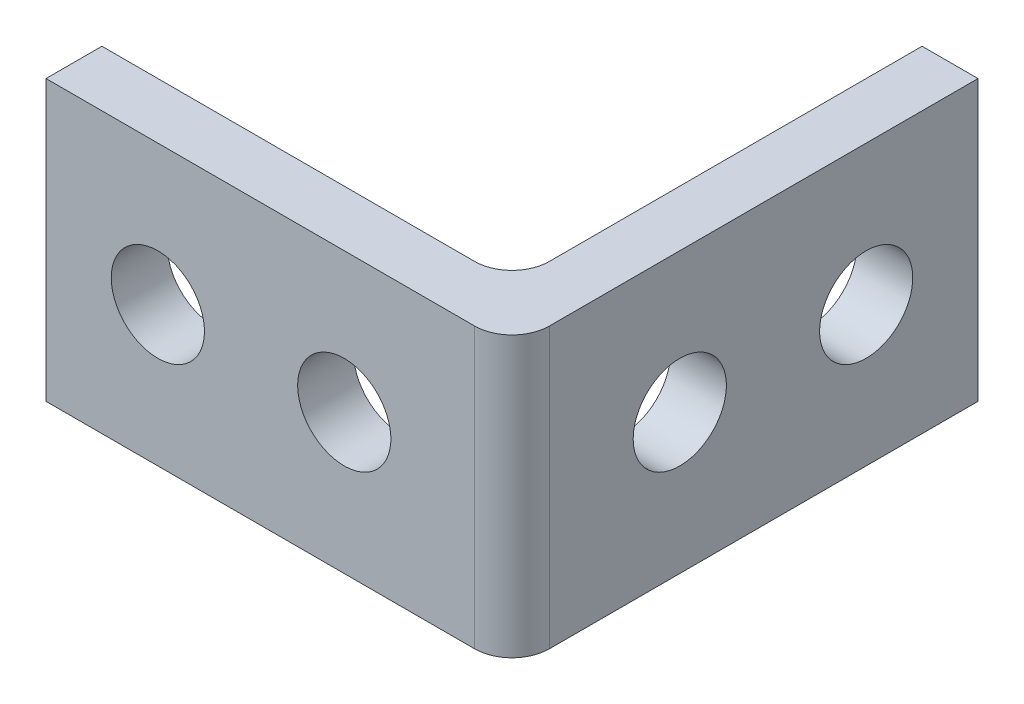
ISO-10303-21;
HEADER;
FILE_DESCRIPTION(('STEP AP214'),'2;1');
FILE_NAME('part.step','',(''),(''),'','','');
FILE_SCHEMA(('AUTOMOTIVE_DESIGN { 1 0 10303 214 1 1 1 1 }'));
ENDSEC;
DATA;
#1=APPLICATION_CONTEXT('core data for automotive mechanical design processes');
#2=APPLICATION_PROTOCOL_DEFINITION('international standard','automotive_design',2000,#1);
#3=PRODUCT_CONTEXT('',#1,'mechanical');
#4=PRODUCT('Part','Part','',(#3));
#5=PRODUCT_RELATED_PRODUCT_CATEGORY('part','',(#4));
#6=PRODUCT_DEFINITION_FORMATION('','',#4);
#7=PRODUCT_DEFINITION_CONTEXT('part definition',#1,'design');
#8=PRODUCT_DEFINITION('design','',#6,#7);
#9=PRODUCT_DEFINITION_SHAPE('','',#8);
#10=(LENGTH_UNIT() NAMED_UNIT(*) SI_UNIT(.MILLI.,.METRE.));
#11=(NAMED_UNIT(*) PLANE_ANGLE_UNIT() SI_UNIT($,.RADIAN.));
#12=(NAMED_UNIT(*) SI_UNIT($,.STERADIAN.) SOLID_ANGLE_UNIT());
#13=UNCERTAINTY_MEASURE_WITH_UNIT(LENGTH_MEASURE(1.E-05),#10,'distance_accuracy_value','');
#14=(GEOMETRIC_REPRESENTATION_CONTEXT(3) GLOBAL_UNCERTAINTY_ASSIGNED_CONTEXT((#13)) GLOBAL_UNIT_ASSIGNED_CONTEXT((#10,
#11,#12)) REPRESENTATION_CONTEXT('',''));
#15=CARTESIAN_POINT('',(0.,0.,0.));
#16=DIRECTION('',(0.,0.,1.));
#17=DIRECTION('',(1.,0.,0.));
#18=AXIS2_PLACEMENT_3D('',#15,#16,#17);
#19=CARTESIAN_POINT('',(0.,15.,-3.));
#20=DIRECTION('',(1.,0.,0.));
#21=DIRECTION('',(0.,0.,-1.));
#22=AXIS2_PLACEMENT_3D('',#19,#20,#21);
#23=PLANE('',#22);
#24=DIRECTION('',(0.,0.,1.));
#25=VECTOR('',#24,1.);
#26=CARTESIAN_POINT('',(0.,0.,-3.));
#27=LINE('',#26,#25);
#28=CARTESIAN_POINT('',(0.,0.,-3.));
#29=VERTEX_POINT('',#28);
#30=CARTESIAN_POINT('',(0.,0.,0.));
#31=VERTEX_POINT('',#30);
#32=EDGE_CURVE('E134',#29,#31,#27,.T.);
#33=ORIENTED_EDGE('',*,*,#32,.T.);
#34=DIRECTION('',(0.,-1.,0.));
#35=VECTOR('',#34,1.);
#36=CARTESIAN_POINT('',(0.,15.,0.));
#37=LINE('',#36,#35);
#38=CARTESIAN_POINT('',(0.,15.,0.));
#39=VERTEX_POINT('',#38);
#40=EDGE_CURVE('E11',#39,#31,#37,.T.);
#41=ORIENTED_EDGE('',*,*,#40,.F.);
#42=DIRECTION('',(0.,0.,1.));
#43=VECTOR('',#42,1.);
#44=CARTESIAN_POINT('',(0.,15.,-3.));
#45=LINE('',#44,#43);
#46=CARTESIAN_POINT('',(0.,15.,-3.));
#47=VERTEX_POINT('',#46);
#48=EDGE_CURVE('E149',#47,#39,#45,.T.);
#49=ORIENTED_EDGE('',*,*,#48,.F.);
#50=DIRECTION('',(0.,-1.,0.));
#51=VECTOR('',#50,1.);
#52=CARTESIAN_POINT('',(0.,15.,-3.));
#53=LINE('',#52,#51);
#54=EDGE_CURVE('E130',#47,#29,#53,.T.);
#55=ORIENTED_EDGE('',*,*,#54,.T.);
#56=EDGE_LOOP('',(#33,#41,#49,#55));
#57=FACE_BOUND('',#56,.T.);
#58=ADVANCED_FACE('F38',(#57),#23,.F.);
#59=CARTESIAN_POINT('',(0.,15.,0.));
#60=DIRECTION('',(0.,0.,-1.));
#61=DIRECTION('',(-1.,0.,0.));
#62=AXIS2_PLACEMENT_3D('',#59,#60,#61);
#63=PLANE('',#62);
#64=CARTESIAN_POINT('',(16.,7.5,0.));
#65=DIRECTION('',(0.,0.,-1.));
#66=DIRECTION('',(-1.,0.,0.));
#67=AXIS2_PLACEMENT_3D('',#64,#65,#66);
#68=CIRCLE('',#67,2.5);
#69=CARTESIAN_POINT('',(13.5,7.5,0.));
#70=VERTEX_POINT('',#69);
#71=EDGE_CURVE('E138',#70,#70,#68,.T.);
#72=ORIENTED_EDGE('',*,*,#71,.T.);
#73=EDGE_LOOP('',(#72));
#74=FACE_BOUND('',#73,.T.);
#75=CARTESIAN_POINT('',(6.,7.5,0.));
#76=DIRECTION('',(0.,0.,-1.));
#77=DIRECTION('',(-1.,0.,0.));
#78=AXIS2_PLACEMENT_3D('',#75,#76,#77);
#79=CIRCLE('',#78,2.5);
#80=CARTESIAN_POINT('',(3.5,7.5,0.));
#81=VERTEX_POINT('',#80);
#82=EDGE_CURVE('E184',#81,#81,#79,.T.);
#83=ORIENTED_EDGE('',*,*,#82,.T.);
#84=EDGE_LOOP('',(#83));
#85=FACE_BOUND('',#84,.T.);
#86=DIRECTION('',(1.,0.,0.));
#87=VECTOR('',#86,1.);
#88=CARTESIAN_POINT('',(0.,0.,0.));
#89=LINE('',#88,#87);
#90=CARTESIAN_POINT('',(23.,0.,0.));
#91=VERTEX_POINT('',#90);
#92=EDGE_CURVE('E137',#31,#91,#89,.T.);
#93=ORIENTED_EDGE('',*,*,#92,.T.);
#94=DIRECTION('',(0.,-1.,0.));
#95=VECTOR('',#94,1.);
#96=CARTESIAN_POINT('',(23.,15.,0.));
#97=LINE('',#96,#95);
#98=CARTESIAN_POINT('',(23.,15.,0.));
#99=VERTEX_POINT('',#98);
#100=EDGE_CURVE('E46',#99,#91,#97,.T.);
#101=ORIENTED_EDGE('',*,*,#100,.F.);
#102=DIRECTION('',(1.,0.,0.));
#103=VECTOR('',#102,1.);
#104=CARTESIAN_POINT('',(0.,15.,0.));
#105=LINE('',#104,#103);
#106=EDGE_CURVE('E97',#39,#99,#105,.T.);
#107=ORIENTED_EDGE('',*,*,#106,.F.);
#108=ORIENTED_EDGE('',*,*,#40,.T.);
#109=EDGE_LOOP('',(#93,#101,#107,#108));
#110=FACE_BOUND('',#109,.T.);
#111=ADVANCED_FACE('F229',(#74,#85,#110),#63,.F.);
#112=CARTESIAN_POINT('',(23.,15.,-2.));
#113=DIRECTION('',(0.,-1.,0.));
#114=DIRECTION('',(0.,0.,-1.));
#115=AXIS2_PLACEMENT_3D('',#112,#113,#114);
#116=CYLINDRICAL_SURFACE('',#115,2.);
#117=CARTESIAN_POINT('',(23.,0.,-2.));
#118=DIRECTION('',(0.,1.,0.));
#119=DIRECTION('',(0.,0.,1.));
#120=AXIS2_PLACEMENT_3D('',#117,#118,#119);
#121=CIRCLE('',#120,2.);
#122=CARTESIAN_POINT('',(25.,0.,-2.));
#123=VERTEX_POINT('',#122);
#124=EDGE_CURVE('E140',#91,#123,#121,.T.);
#125=ORIENTED_EDGE('',*,*,#124,.T.);
#126=DIRECTION('',(0.,-1.,0.));
#127=VECTOR('',#126,1.);
#128=CARTESIAN_POINT('',(25.,15.,-2.));
#129=LINE('',#128,#127);
#130=CARTESIAN_POINT('',(25.,15.,-2.));
#131=VERTEX_POINT('',#130);
#132=EDGE_CURVE('E156',#131,#123,#129,.T.);
#133=ORIENTED_EDGE('',*,*,#132,.F.);
#134=CARTESIAN_POINT('',(23.,15.,-2.));
#135=DIRECTION('',(0.,1.,0.));
#136=DIRECTION('',(0.,0.,1.));
#137=AXIS2_PLACEMENT_3D('',#134,#135,#136);
#138=CIRCLE('',#137,2.);
#139=EDGE_CURVE('E164',#99,#131,#138,.T.);
#140=ORIENTED_EDGE('',*,*,#139,.F.);
#141=ORIENTED_EDGE('',*,*,#100,.T.);
#142=EDGE_LOOP('',(#125,#133,#140,#141));
#143=FACE_BOUND('',#142,.T.);
#144=ADVANCED_FACE('F162',(#143),#116,.T.);
#145=CARTESIAN_POINT('',(25.,15.,-2.));
#146=DIRECTION('',(-1.,0.,0.));
#147=DIRECTION('',(0.,0.,1.));
#148=AXIS2_PLACEMENT_3D('',#145,#146,#147);
#149=PLANE('',#148);
#150=CARTESIAN_POINT('',(25.,7.5,-9.));
#151=DIRECTION('',(-1.,0.,0.));
#152=DIRECTION('',(0.,0.,1.));
#153=AXIS2_PLACEMENT_3D('',#150,#151,#152);
#154=CIRCLE('',#153,2.5);
#155=CARTESIAN_POINT('',(25.,7.5,-6.5));
#156=VERTEX_POINT('',#155);
#157=EDGE_CURVE('E191',#156,#156,#154,.T.);
#158=ORIENTED_EDGE('',*,*,#157,.T.);
#159=EDGE_LOOP('',(#158));
#160=FACE_BOUND('',#159,.T.);
#161=CARTESIAN_POINT('',(25.,7.5,-19.));
#162=DIRECTION('',(-1.,0.,0.));
#163=DIRECTION('',(0.,0.,1.));
#164=AXIS2_PLACEMENT_3D('',#161,#162,#163);
#165=CIRCLE('',#164,2.5);
#166=CARTESIAN_POINT('',(25.,7.5,-16.5));
#167=VERTEX_POINT('',#166);
#168=EDGE_CURVE('E196',#167,#167,#165,.T.);
#169=ORIENTED_EDGE('',*,*,#168,.T.);
#170=EDGE_LOOP('',(#169));
#171=FACE_BOUND('',#170,.T.);
#172=DIRECTION('',(0.,0.,-1.));
#173=VECTOR('',#172,1.);
#174=CARTESIAN_POINT('',(25.,0.,-2.));
#175=LINE('',#174,#173);
#176=CARTESIAN_POINT('',(25.,0.,-25.));
#177=VERTEX_POINT('',#176);
#178=EDGE_CURVE('E142',#123,#177,#175,.T.);
#179=ORIENTED_EDGE('',*,*,#178,.T.);
#180=DIRECTION('',(0.,-1.,0.));
#181=VECTOR('',#180,1.);
#182=CARTESIAN_POINT('',(25.,15.,-25.));
#183=LINE('',#182,#181);
#184=CARTESIAN_POINT('',(25.,15.,-25.));
#185=VERTEX_POINT('',#184);
#186=EDGE_CURVE('E153',#185,#177,#183,.T.);
#187=ORIENTED_EDGE('',*,*,#186,.F.);
#188=DIRECTION('',(0.,0.,-1.));
#189=VECTOR('',#188,1.);
#190=CARTESIAN_POINT('',(25.,15.,-2.));
#191=LINE('',#190,#189);
#192=EDGE_CURVE('E176',#131,#185,#191,.T.);
#193=ORIENTED_EDGE('',*,*,#192,.F.);
#194=ORIENTED_EDGE('',*,*,#132,.T.);
#195=EDGE_LOOP('',(#179,#187,#193,#194));
#196=FACE_BOUND('',#195,.T.);
#197=ADVANCED_FACE('F172',(#160,#171,#196),#149,.F.);
#198=CARTESIAN_POINT('',(25.,15.,-25.));
#199=DIRECTION('',(0.,0.,1.));
#200=DIRECTION('',(1.,0.,0.));
#201=AXIS2_PLACEMENT_3D('',#198,#199,#200);
#202=PLANE('',#201);
#203=DIRECTION('',(-1.,0.,0.));
#204=VECTOR('',#203,1.);
#205=CARTESIAN_POINT('',(25.,0.,-25.));
#206=LINE('',#205,#204);
#207=CARTESIAN_POINT('',(22.,0.,-25.));
#208=VERTEX_POINT('',#207);
#209=EDGE_CURVE('E144',#177,#208,#206,.T.);
#210=ORIENTED_EDGE('',*,*,#209,.T.);
#211=DIRECTION('',(0.,-1.,0.));
#212=VECTOR('',#211,1.);
#213=CARTESIAN_POINT('',(22.,15.,-25.));
#214=LINE('',#213,#212);
#215=CARTESIAN_POINT('',(22.,15.,-25.));
#216=VERTEX_POINT('',#215);
#217=EDGE_CURVE('E125',#216,#208,#214,.T.);
#218=ORIENTED_EDGE('',*,*,#217,.F.);
#219=DIRECTION('',(-1.,0.,0.));
#220=VECTOR('',#219,1.);
#221=CARTESIAN_POINT('',(25.,15.,-25.));
#222=LINE('',#221,#220);
#223=EDGE_CURVE('E116',#185,#216,#222,.T.);
#224=ORIENTED_EDGE('',*,*,#223,.F.);
#225=ORIENTED_EDGE('',*,*,#186,.T.);
#226=EDGE_LOOP('',(#210,#218,#224,#225));
#227=FACE_BOUND('',#226,.T.);
#228=ADVANCED_FACE('F175',(#227),#202,.F.);
#229=CARTESIAN_POINT('',(22.,15.,-25.));
#230=DIRECTION('',(1.,0.,0.));
#231=DIRECTION('',(0.,0.,-1.));
#232=AXIS2_PLACEMENT_3D('',#229,#230,#231);
#233=PLANE('',#232);
#234=CARTESIAN_POINT('',(22.,7.5,-9.));
#235=DIRECTION('',(-1.,0.,0.));
#236=DIRECTION('',(0.,0.,1.));
#237=AXIS2_PLACEMENT_3D('',#234,#235,#236);
#238=CIRCLE('',#237,2.5);
#239=CARTESIAN_POINT('',(22.,7.5,-6.5));
#240=VERTEX_POINT('',#239);
#241=EDGE_CURVE('E199',#240,#240,#238,.T.);
#242=ORIENTED_EDGE('',*,*,#241,.F.);
#243=EDGE_LOOP('',(#242));
#244=FACE_BOUND('',#243,.T.);
#245=CARTESIAN_POINT('',(22.,7.5,-19.));
#246=DIRECTION('',(-1.,0.,0.));
#247=DIRECTION('',(0.,0.,1.));
#248=AXIS2_PLACEMENT_3D('',#245,#246,#247);
#249=CIRCLE('',#248,2.5);
#250=CARTESIAN_POINT('',(22.,7.5,-16.5));
#251=VERTEX_POINT('',#250);
#252=EDGE_CURVE('E200',#251,#251,#249,.T.);
#253=ORIENTED_EDGE('',*,*,#252,.F.);
#254=EDGE_LOOP('',(#253));
#255=FACE_BOUND('',#254,.T.);
#256=DIRECTION('',(0.,0.,1.));
#257=VECTOR('',#256,1.);
#258=CARTESIAN_POINT('',(22.,0.,-25.));
#259=LINE('',#258,#257);
#260=CARTESIAN_POINT('',(22.,0.,-5.));
#261=VERTEX_POINT('',#260);
#262=EDGE_CURVE('E124',#208,#261,#259,.T.);
#263=ORIENTED_EDGE('',*,*,#262,.T.);
#264=DIRECTION('',(0.,-1.,0.));
#265=VECTOR('',#264,1.);
#266=CARTESIAN_POINT('',(22.,15.,-5.));
#267=LINE('',#266,#265);
#268=CARTESIAN_POINT('',(22.,15.,-5.));
#269=VERTEX_POINT('',#268);
#270=EDGE_CURVE('E121',#269,#261,#267,.T.);
#271=ORIENTED_EDGE('',*,*,#270,.F.);
#272=DIRECTION('',(0.,0.,1.));
#273=VECTOR('',#272,1.);
#274=CARTESIAN_POINT('',(22.,15.,-25.));
#275=LINE('',#274,#273);
#276=EDGE_CURVE('E110',#216,#269,#275,.T.);
#277=ORIENTED_EDGE('',*,*,#276,.F.);
#278=ORIENTED_EDGE('',*,*,#217,.T.);
#279=EDGE_LOOP('',(#263,#271,#277,#278));
#280=FACE_BOUND('',#279,.T.);
#281=ADVANCED_FACE('F122',(#244,#255,#280),#233,.F.);
#282=CARTESIAN_POINT('',(20.,15.,-5.));
#283=DIRECTION('',(0.,-1.,0.));
#284=DIRECTION('',(0.,0.,-1.));
#285=AXIS2_PLACEMENT_3D('',#282,#283,#284);
#286=CYLINDRICAL_SURFACE('',#285,2.);
#287=CARTESIAN_POINT('',(20.,0.,-5.));
#288=DIRECTION('',(0.,-1.,0.));
#289=DIRECTION('',(0.,0.,-1.));
#290=AXIS2_PLACEMENT_3D('',#287,#288,#289);
#291=CIRCLE('',#290,2.);
#292=CARTESIAN_POINT('',(20.,0.,-3.));
#293=VERTEX_POINT('',#292);
#294=EDGE_CURVE('E83',#261,#293,#291,.T.);
#295=ORIENTED_EDGE('',*,*,#294,.T.);
#296=DIRECTION('',(0.,-1.,0.));
#297=VECTOR('',#296,1.);
#298=CARTESIAN_POINT('',(20.,15.,-3.));
#299=LINE('',#298,#297);
#300=CARTESIAN_POINT('',(20.,15.,-3.));
#301=VERTEX_POINT('',#300);
#302=EDGE_CURVE('E126',#301,#293,#299,.T.);
#303=ORIENTED_EDGE('',*,*,#302,.F.);
#304=CARTESIAN_POINT('',(20.,15.,-5.));
#305=DIRECTION('',(0.,-1.,0.));
#306=DIRECTION('',(0.,0.,-1.));
#307=AXIS2_PLACEMENT_3D('',#304,#305,#306);
#308=CIRCLE('',#307,2.);
#309=EDGE_CURVE('E114',#269,#301,#308,.T.);
#310=ORIENTED_EDGE('',*,*,#309,.F.);
#311=ORIENTED_EDGE('',*,*,#270,.T.);
#312=EDGE_LOOP('',(#295,#303,#310,#311));
#313=FACE_BOUND('',#312,.T.);
#314=ADVANCED_FACE('F128',(#313),#286,.F.);
#315=CARTESIAN_POINT('',(20.,15.,-3.));
#316=DIRECTION('',(0.,0.,1.));
#317=DIRECTION('',(1.,0.,0.));
#318=AXIS2_PLACEMENT_3D('',#315,#316,#317);
#319=PLANE('',#318);
#320=CARTESIAN_POINT('',(16.,7.5,-3.));
#321=DIRECTION('',(0.,0.,-1.));
#322=DIRECTION('',(-1.,0.,0.));
#323=AXIS2_PLACEMENT_3D('',#320,#321,#322);
#324=CIRCLE('',#323,2.5);
#325=CARTESIAN_POINT('',(13.5,7.5,-3.));
#326=VERTEX_POINT('',#325);
#327=EDGE_CURVE('E187',#326,#326,#324,.T.);
#328=ORIENTED_EDGE('',*,*,#327,.F.);
#329=EDGE_LOOP('',(#328));
#330=FACE_BOUND('',#329,.T.);
#331=CARTESIAN_POINT('',(6.,7.5,-3.));
#332=DIRECTION('',(0.,0.,-1.));
#333=DIRECTION('',(-1.,0.,0.));
#334=AXIS2_PLACEMENT_3D('',#331,#332,#333);
#335=CIRCLE('',#334,2.5);
#336=CARTESIAN_POINT('',(3.5,7.5,-3.));
#337=VERTEX_POINT('',#336);
#338=EDGE_CURVE('E188',#337,#337,#335,.T.);
#339=ORIENTED_EDGE('',*,*,#338,.F.);
#340=EDGE_LOOP('',(#339));
#341=FACE_BOUND('',#340,.T.);
#342=DIRECTION('',(-1.,0.,0.));
#343=VECTOR('',#342,1.);
#344=CARTESIAN_POINT('',(20.,0.,-3.));
#345=LINE('',#344,#343);
#346=EDGE_CURVE('E89',#293,#29,#345,.T.);
#347=ORIENTED_EDGE('',*,*,#346,.T.);
#348=ORIENTED_EDGE('',*,*,#54,.F.);
#349=DIRECTION('',(-1.,0.,0.));
#350=VECTOR('',#349,1.);
#351=CARTESIAN_POINT('',(20.,15.,-3.));
#352=LINE('',#351,#350);
#353=EDGE_CURVE('E54',#301,#47,#352,.T.);
#354=ORIENTED_EDGE('',*,*,#353,.F.);
#355=ORIENTED_EDGE('',*,*,#302,.T.);
#356=EDGE_LOOP('',(#347,#348,#354,#355));
#357=FACE_BOUND('',#356,.T.);
#358=ADVANCED_FACE('F239',(#330,#341,#357),#319,.F.);
#359=CARTESIAN_POINT('',(23.,15.,-2.));
#360=DIRECTION('',(0.,1.,0.));
#361=DIRECTION('',(0.,0.,1.));
#362=AXIS2_PLACEMENT_3D('',#359,#360,#361);
#363=PLANE('',#362);
#364=ORIENTED_EDGE('',*,*,#48,.T.);
#365=ORIENTED_EDGE('',*,*,#106,.T.);
#366=ORIENTED_EDGE('',*,*,#139,.T.);
#367=ORIENTED_EDGE('',*,*,#192,.T.);
#368=ORIENTED_EDGE('',*,*,#223,.T.);
#369=ORIENTED_EDGE('',*,*,#276,.T.);
#370=ORIENTED_EDGE('',*,*,#309,.T.);
#371=ORIENTED_EDGE('',*,*,#353,.T.);
#372=EDGE_LOOP('',(#364,#365,#366,#367,#368,#369,#370,#371));
#373=FACE_BOUND('',#372,.T.);
#374=ADVANCED_FACE('F112',(#373),#363,.T.);
#375=CARTESIAN_POINT('',(23.,0.,-2.));
#376=DIRECTION('',(0.,1.,0.));
#377=DIRECTION('',(0.,0.,1.));
#378=AXIS2_PLACEMENT_3D('',#375,#376,#377);
#379=PLANE('',#378);
#380=ORIENTED_EDGE('',*,*,#32,.F.);
#381=ORIENTED_EDGE('',*,*,#346,.F.);
#382=ORIENTED_EDGE('',*,*,#294,.F.);
#383=ORIENTED_EDGE('',*,*,#262,.F.);
#384=ORIENTED_EDGE('',*,*,#209,.F.);
#385=ORIENTED_EDGE('',*,*,#178,.F.);
#386=ORIENTED_EDGE('',*,*,#124,.F.);
#387=ORIENTED_EDGE('',*,*,#92,.F.);
#388=EDGE_LOOP('',(#380,#381,#382,#383,#384,#385,#386,#387));
#389=FACE_BOUND('',#388,.T.);
#390=ADVANCED_FACE('F168',(#389),#379,.F.);
#391=CARTESIAN_POINT('',(6.,7.5,17.));
#392=DIRECTION('',(0.,0.,-1.));
#393=DIRECTION('',(-1.,0.,0.));
#394=AXIS2_PLACEMENT_3D('',#391,#392,#393);
#395=CYLINDRICAL_SURFACE('',#394,2.5);
#396=ORIENTED_EDGE('',*,*,#338,.T.);
#397=EDGE_LOOP('',(#396));
#398=FACE_BOUND('',#397,.T.);
#399=ORIENTED_EDGE('',*,*,#82,.F.);
#400=EDGE_LOOP('',(#399));
#401=FACE_BOUND('',#400,.T.);
#402=ADVANCED_FACE('F253',(#398,#401),#395,.F.);
#403=CARTESIAN_POINT('',(16.,7.5,17.));
#404=DIRECTION('',(0.,0.,-1.));
#405=DIRECTION('',(-1.,0.,0.));
#406=AXIS2_PLACEMENT_3D('',#403,#404,#405);
#407=CYLINDRICAL_SURFACE('',#406,2.5);
#408=ORIENTED_EDGE('',*,*,#327,.T.);
#409=EDGE_LOOP('',(#408));
#410=FACE_BOUND('',#409,.T.);
#411=ORIENTED_EDGE('',*,*,#71,.F.);
#412=EDGE_LOOP('',(#411));
#413=FACE_BOUND('',#412,.T.);
#414=ADVANCED_FACE('F217',(#410,#413),#407,.F.);
#415=CARTESIAN_POINT('',(37.,7.5,-19.));
#416=DIRECTION('',(-1.,0.,0.));
#417=DIRECTION('',(0.,0.,1.));
#418=AXIS2_PLACEMENT_3D('',#415,#416,#417);
#419=CYLINDRICAL_SURFACE('',#418,2.5);
#420=ORIENTED_EDGE('',*,*,#252,.T.);
#421=EDGE_LOOP('',(#420));
#422=FACE_BOUND('',#421,.T.);
#423=ORIENTED_EDGE('',*,*,#168,.F.);
#424=EDGE_LOOP('',(#423));
#425=FACE_BOUND('',#424,.T.);
#426=ADVANCED_FACE('F214',(#422,#425),#419,.F.);
#427=CARTESIAN_POINT('',(37.,7.5,-9.));
#428=DIRECTION('',(-1.,0.,0.));
#429=DIRECTION('',(0.,0.,1.));
#430=AXIS2_PLACEMENT_3D('',#427,#428,#429);
#431=CYLINDRICAL_SURFACE('',#430,2.5);
#432=ORIENTED_EDGE('',*,*,#241,.T.);
#433=EDGE_LOOP('',(#432));
#434=FACE_BOUND('',#433,.T.);
#435=ORIENTED_EDGE('',*,*,#157,.F.);
#436=EDGE_LOOP('',(#435));
#437=FACE_BOUND('',#436,.T.);
#438=ADVANCED_FACE('F206',(#434,#437),#431,.F.);
#439=CLOSED_SHELL('',(#58,#111,#144,#197,#228,#281,#314,#358,#374,#390,#402,#414,#426,#438));
#440=MANIFOLD_SOLID_BREP('B2',#439);
#441=ADVANCED_BREP_SHAPE_REPRESENTATION('',(#18,#440),#14);
#442=SHAPE_DEFINITION_REPRESENTATION(#9,#441);
ENDSEC;
END-ISO-10303-21;
